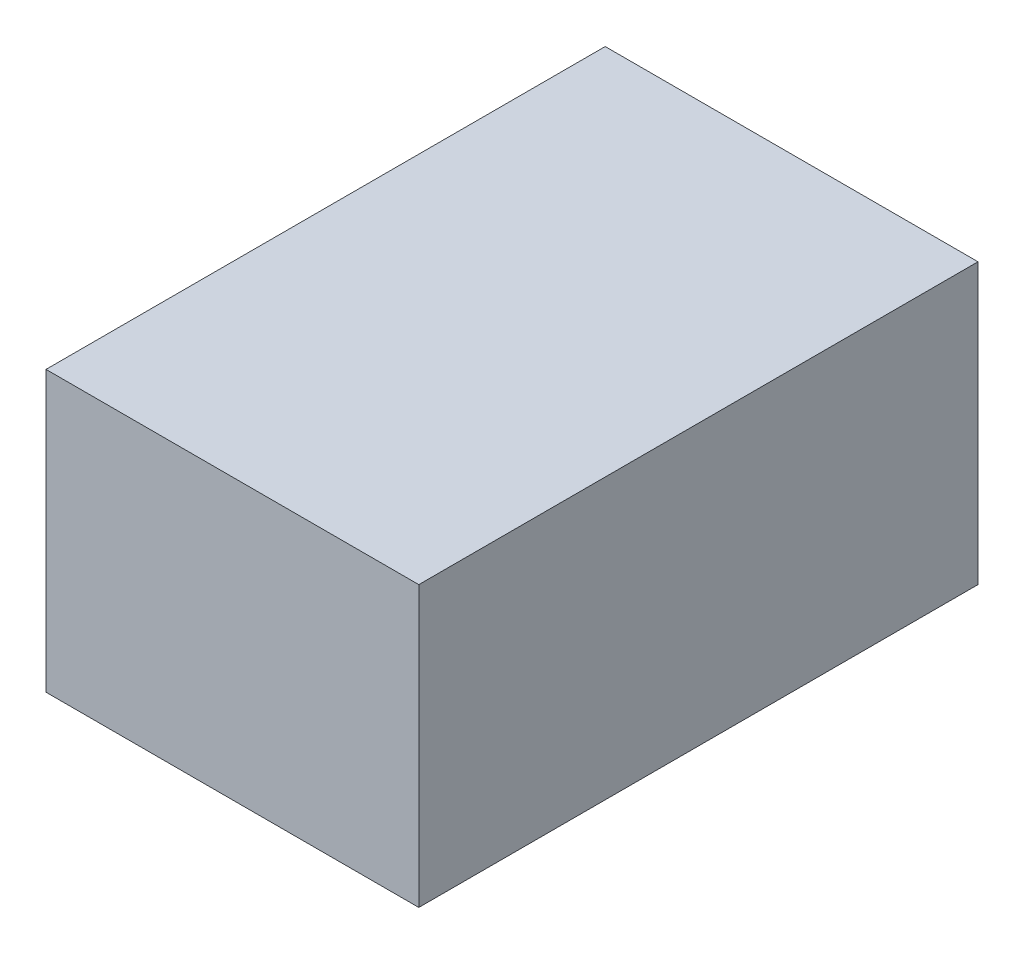
ISO-10303-21;
HEADER;
FILE_DESCRIPTION(('STEP AP214'),'2;1');
FILE_NAME('part.step','',(''),(''),'','','');
FILE_SCHEMA(('AUTOMOTIVE_DESIGN { 1 0 10303 214 1 1 1 1 }'));
ENDSEC;
DATA;
#1=APPLICATION_CONTEXT('core data for automotive mechanical design processes');
#2=APPLICATION_PROTOCOL_DEFINITION('international standard','automotive_design',2000,#1);
#3=PRODUCT_CONTEXT('',#1,'mechanical');
#4=PRODUCT('Part','Part','',(#3));
#5=PRODUCT_RELATED_PRODUCT_CATEGORY('part','',(#4));
#6=PRODUCT_DEFINITION_FORMATION('','',#4);
#7=PRODUCT_DEFINITION_CONTEXT('part definition',#1,'design');
#8=PRODUCT_DEFINITION('design','',#6,#7);
#9=PRODUCT_DEFINITION_SHAPE('','',#8);
#10=(LENGTH_UNIT() NAMED_UNIT(*) SI_UNIT(.MILLI.,.METRE.));
#11=(NAMED_UNIT(*) PLANE_ANGLE_UNIT() SI_UNIT($,.RADIAN.));
#12=(NAMED_UNIT(*) SI_UNIT($,.STERADIAN.) SOLID_ANGLE_UNIT());
#13=UNCERTAINTY_MEASURE_WITH_UNIT(LENGTH_MEASURE(1.E-05),#10,'distance_accuracy_value','');
#14=(GEOMETRIC_REPRESENTATION_CONTEXT(3) GLOBAL_UNCERTAINTY_ASSIGNED_CONTEXT((#13)) GLOBAL_UNIT_ASSIGNED_CONTEXT((#10,
#11,#12)) REPRESENTATION_CONTEXT('',''));
#15=CARTESIAN_POINT('',(0.,0.,0.));
#16=DIRECTION('',(0.,0.,1.));
#17=DIRECTION('',(1.,0.,0.));
#18=AXIS2_PLACEMENT_3D('',#15,#16,#17);
#19=CARTESIAN_POINT('',(0.,0.,9.));
#20=DIRECTION('',(0.,0.,1.));
#21=DIRECTION('',(1.,0.,0.));
#22=AXIS2_PLACEMENT_3D('',#19,#20,#21);
#23=PLANE('',#22);
#24=DIRECTION('',(-1.,0.,0.));
#25=VECTOR('',#24,1.);
#26=CARTESIAN_POINT('',(0.,-4.5,9.));
#27=LINE('',#26,#25);
#28=CARTESIAN_POINT('',(6.,-4.5,9.));
#29=VERTEX_POINT('',#28);
#30=CARTESIAN_POINT('',(-6.,-4.5,9.));
#31=VERTEX_POINT('',#30);
#32=EDGE_CURVE('E11',#29,#31,#27,.T.);
#33=ORIENTED_EDGE('',*,*,#32,.F.);
#34=DIRECTION('',(0.,-1.,0.));
#35=VECTOR('',#34,1.);
#36=CARTESIAN_POINT('',(6.,0.,9.));
#37=LINE('',#36,#35);
#38=CARTESIAN_POINT('',(6.,4.5,9.));
#39=VERTEX_POINT('',#38);
#40=EDGE_CURVE('E61',#39,#29,#37,.T.);
#41=ORIENTED_EDGE('',*,*,#40,.F.);
#42=DIRECTION('',(1.,0.,0.));
#43=VECTOR('',#42,1.);
#44=CARTESIAN_POINT('',(0.,4.5,9.));
#45=LINE('',#44,#43);
#46=CARTESIAN_POINT('',(-6.,4.5,9.));
#47=VERTEX_POINT('',#46);
#48=EDGE_CURVE('E87',#47,#39,#45,.T.);
#49=ORIENTED_EDGE('',*,*,#48,.F.);
#50=DIRECTION('',(0.,1.,0.));
#51=VECTOR('',#50,1.);
#52=CARTESIAN_POINT('',(-6.,0.,9.));
#53=LINE('',#52,#51);
#54=EDGE_CURVE('E24',#31,#47,#53,.T.);
#55=ORIENTED_EDGE('',*,*,#54,.F.);
#56=EDGE_LOOP('',(#33,#41,#49,#55));
#57=FACE_BOUND('',#56,.T.);
#58=ADVANCED_FACE('F17',(#57),#23,.T.);
#59=CARTESIAN_POINT('',(0.,-4.5,-9.));
#60=DIRECTION('',(0.,-1.,0.));
#61=DIRECTION('',(0.,0.,-1.));
#62=AXIS2_PLACEMENT_3D('',#59,#60,#61);
#63=PLANE('',#62);
#64=DIRECTION('',(0.,0.,1.));
#65=VECTOR('',#64,1.);
#66=CARTESIAN_POINT('',(6.,-4.5,-9.));
#67=LINE('',#66,#65);
#68=CARTESIAN_POINT('',(6.,-4.5,-9.));
#69=VERTEX_POINT('',#68);
#70=EDGE_CURVE('E53',#69,#29,#67,.T.);
#71=ORIENTED_EDGE('',*,*,#70,.T.);
#72=ORIENTED_EDGE('',*,*,#32,.T.);
#73=DIRECTION('',(0.,0.,1.));
#74=VECTOR('',#73,1.);
#75=CARTESIAN_POINT('',(-6.,-4.5,-9.));
#76=LINE('',#75,#74);
#77=CARTESIAN_POINT('',(-6.,-4.5,-9.));
#78=VERTEX_POINT('',#77);
#79=EDGE_CURVE('E70',#78,#31,#76,.T.);
#80=ORIENTED_EDGE('',*,*,#79,.F.);
#81=DIRECTION('',(1.,0.,0.));
#82=VECTOR('',#81,1.);
#83=CARTESIAN_POINT('',(0.,-4.5,-9.));
#84=LINE('',#83,#82);
#85=EDGE_CURVE('E65',#78,#69,#84,.T.);
#86=ORIENTED_EDGE('',*,*,#85,.T.);
#87=EDGE_LOOP('',(#71,#72,#80,#86));
#88=FACE_BOUND('',#87,.T.);
#89=ADVANCED_FACE('F66',(#88),#63,.T.);
#90=CARTESIAN_POINT('',(-6.,0.,-9.));
#91=DIRECTION('',(-1.,0.,0.));
#92=DIRECTION('',(0.,0.,1.));
#93=AXIS2_PLACEMENT_3D('',#90,#91,#92);
#94=PLANE('',#93);
#95=ORIENTED_EDGE('',*,*,#79,.T.);
#96=ORIENTED_EDGE('',*,*,#54,.T.);
#97=DIRECTION('',(0.,0.,1.));
#98=VECTOR('',#97,1.);
#99=CARTESIAN_POINT('',(-6.,4.5,-9.));
#100=LINE('',#99,#98);
#101=CARTESIAN_POINT('',(-6.,4.5,-9.));
#102=VERTEX_POINT('',#101);
#103=EDGE_CURVE('E85',#102,#47,#100,.T.);
#104=ORIENTED_EDGE('',*,*,#103,.F.);
#105=DIRECTION('',(0.,-1.,0.));
#106=VECTOR('',#105,1.);
#107=CARTESIAN_POINT('',(-6.,0.,-9.));
#108=LINE('',#107,#106);
#109=EDGE_CURVE('E75',#102,#78,#108,.T.);
#110=ORIENTED_EDGE('',*,*,#109,.T.);
#111=EDGE_LOOP('',(#95,#96,#104,#110));
#112=FACE_BOUND('',#111,.T.);
#113=ADVANCED_FACE('F93',(#112),#94,.T.);
#114=CARTESIAN_POINT('',(0.,4.5,-9.));
#115=DIRECTION('',(0.,1.,0.));
#116=DIRECTION('',(0.,0.,1.));
#117=AXIS2_PLACEMENT_3D('',#114,#115,#116);
#118=PLANE('',#117);
#119=ORIENTED_EDGE('',*,*,#103,.T.);
#120=ORIENTED_EDGE('',*,*,#48,.T.);
#121=DIRECTION('',(0.,0.,1.));
#122=VECTOR('',#121,1.);
#123=CARTESIAN_POINT('',(6.,4.5,-9.));
#124=LINE('',#123,#122);
#125=CARTESIAN_POINT('',(6.,4.5,-9.));
#126=VERTEX_POINT('',#125);
#127=EDGE_CURVE('E62',#126,#39,#124,.T.);
#128=ORIENTED_EDGE('',*,*,#127,.F.);
#129=DIRECTION('',(-1.,0.,0.));
#130=VECTOR('',#129,1.);
#131=CARTESIAN_POINT('',(0.,4.5,-9.));
#132=LINE('',#131,#130);
#133=EDGE_CURVE('E76',#126,#102,#132,.T.);
#134=ORIENTED_EDGE('',*,*,#133,.T.);
#135=EDGE_LOOP('',(#119,#120,#128,#134));
#136=FACE_BOUND('',#135,.T.);
#137=ADVANCED_FACE('F90',(#136),#118,.T.);
#138=CARTESIAN_POINT('',(0.,0.,-9.));
#139=DIRECTION('',(0.,0.,-1.));
#140=DIRECTION('',(-1.,0.,0.));
#141=AXIS2_PLACEMENT_3D('',#138,#139,#140);
#142=PLANE('',#141);
#143=DIRECTION('',(0.,1.,0.));
#144=VECTOR('',#143,1.);
#145=CARTESIAN_POINT('',(6.,0.,-9.));
#146=LINE('',#145,#144);
#147=EDGE_CURVE('E56',#69,#126,#146,.T.);
#148=ORIENTED_EDGE('',*,*,#147,.F.);
#149=ORIENTED_EDGE('',*,*,#85,.F.);
#150=ORIENTED_EDGE('',*,*,#109,.F.);
#151=ORIENTED_EDGE('',*,*,#133,.F.);
#152=EDGE_LOOP('',(#148,#149,#150,#151));
#153=FACE_BOUND('',#152,.T.);
#154=ADVANCED_FACE('F72',(#153),#142,.T.);
#155=CARTESIAN_POINT('',(6.,0.,-9.));
#156=DIRECTION('',(1.,0.,0.));
#157=DIRECTION('',(0.,0.,-1.));
#158=AXIS2_PLACEMENT_3D('',#155,#156,#157);
#159=PLANE('',#158);
#160=ORIENTED_EDGE('',*,*,#147,.T.);
#161=ORIENTED_EDGE('',*,*,#127,.T.);
#162=ORIENTED_EDGE('',*,*,#40,.T.);
#163=ORIENTED_EDGE('',*,*,#70,.F.);
#164=EDGE_LOOP('',(#160,#161,#162,#163));
#165=FACE_BOUND('',#164,.T.);
#166=ADVANCED_FACE('F57',(#165),#159,.T.);
#167=CLOSED_SHELL('',(#58,#89,#113,#137,#154,#166));
#168=MANIFOLD_SOLID_BREP('B1',#167);
#169=ADVANCED_BREP_SHAPE_REPRESENTATION('',(#18,#168),#14);
#170=SHAPE_DEFINITION_REPRESENTATION(#9,#169);
ENDSEC;
END-ISO-10303-21;
